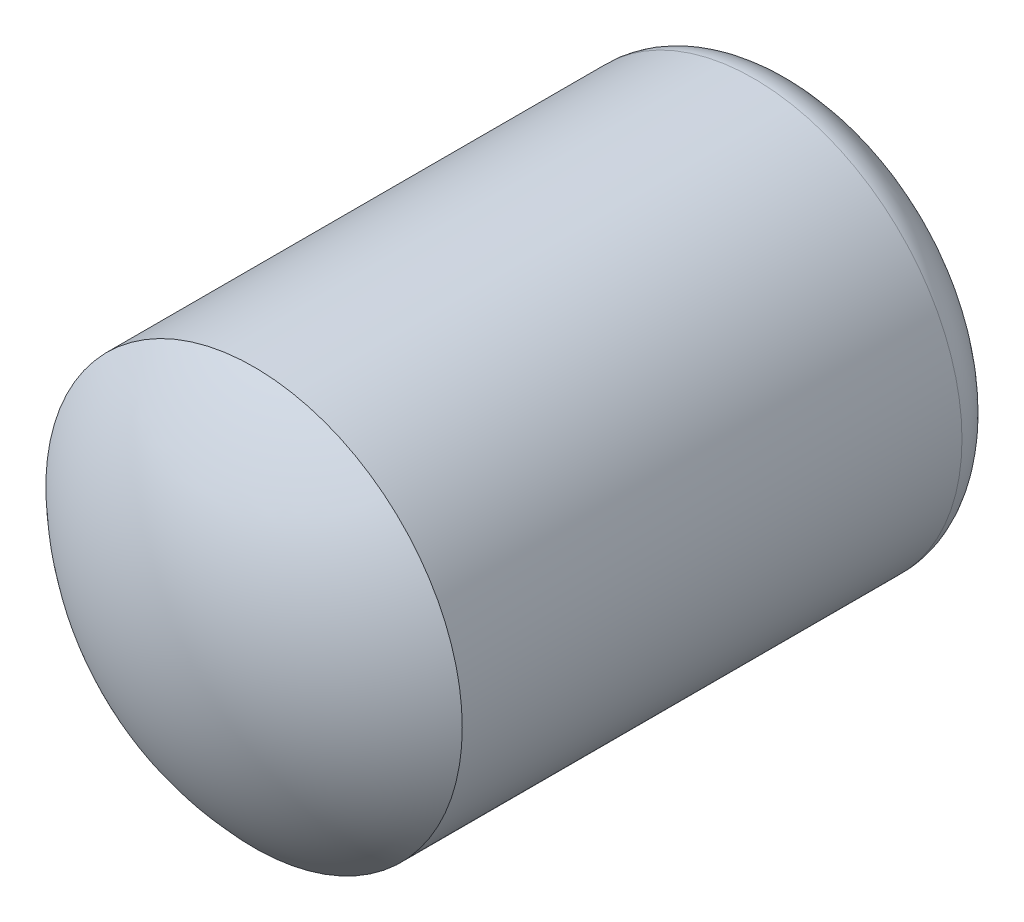
ISO-10303-21;
HEADER;
FILE_DESCRIPTION(('STEP AP214'),'2;1');
FILE_NAME('part.step','',(''),(''),'','','');
FILE_SCHEMA(('AUTOMOTIVE_DESIGN { 1 0 10303 214 1 1 1 1 }'));
ENDSEC;
DATA;
#1=APPLICATION_CONTEXT('core data for automotive mechanical design processes');
#2=APPLICATION_PROTOCOL_DEFINITION('international standard','automotive_design',2000,#1);
#3=PRODUCT_CONTEXT('',#1,'mechanical');
#4=PRODUCT('Part','Part','',(#3));
#5=PRODUCT_RELATED_PRODUCT_CATEGORY('part','',(#4));
#6=PRODUCT_DEFINITION_FORMATION('','',#4);
#7=PRODUCT_DEFINITION_CONTEXT('part definition',#1,'design');
#8=PRODUCT_DEFINITION('design','',#6,#7);
#9=PRODUCT_DEFINITION_SHAPE('','',#8);
#10=(LENGTH_UNIT() NAMED_UNIT(*) SI_UNIT(.MILLI.,.METRE.));
#11=(NAMED_UNIT(*) PLANE_ANGLE_UNIT() SI_UNIT($,.RADIAN.));
#12=(NAMED_UNIT(*) SI_UNIT($,.STERADIAN.) SOLID_ANGLE_UNIT());
#13=UNCERTAINTY_MEASURE_WITH_UNIT(LENGTH_MEASURE(1.E-05),#10,'distance_accuracy_value','');
#14=(GEOMETRIC_REPRESENTATION_CONTEXT(3) GLOBAL_UNCERTAINTY_ASSIGNED_CONTEXT((#13)) GLOBAL_UNIT_ASSIGNED_CONTEXT((#10,
#11,#12)) REPRESENTATION_CONTEXT('',''));
#15=CARTESIAN_POINT('',(0.,0.,0.));
#16=DIRECTION('',(0.,0.,1.));
#17=DIRECTION('',(1.,0.,0.));
#18=AXIS2_PLACEMENT_3D('',#15,#16,#17);
#19=CARTESIAN_POINT('',(114.423401370023,123.880750732838,2.54));
#20=DIRECTION('',(0.,0.,-1.));
#21=DIRECTION('',(-1.,0.,0.));
#22=AXIS2_PLACEMENT_3D('',#19,#20,#21);
#23=CYLINDRICAL_SURFACE('',#22,12.699999999999);
#24=CARTESIAN_POINT('',(114.423401370023,123.880750732838,2.54));
#25=DIRECTION('',(0.,0.,1.));
#26=DIRECTION('',(1.,0.,0.));
#27=AXIS2_PLACEMENT_3D('',#24,#25,#26);
#28=CIRCLE('',#27,12.699999999999);
#29=CARTESIAN_POINT('',(127.123401370022,123.880750732838,2.54));
#30=VERTEX_POINT('',#29);
#31=EDGE_CURVE('E11',#30,#30,#28,.T.);
#32=ORIENTED_EDGE('',*,*,#31,.F.);
#33=EDGE_LOOP('',(#32));
#34=FACE_BOUND('',#33,.T.);
#35=CARTESIAN_POINT('',(114.423401370023,123.880750732838,-27.94));
#36=DIRECTION('',(0.,0.,1.));
#37=DIRECTION('',(1.,0.,0.));
#38=AXIS2_PLACEMENT_3D('',#35,#36,#37);
#39=CIRCLE('',#38,12.699999999999);
#40=CARTESIAN_POINT('',(127.123401370022,123.880750732838,-27.94));
#41=VERTEX_POINT('',#40);
#42=EDGE_CURVE('E44',#41,#41,#39,.T.);
#43=ORIENTED_EDGE('',*,*,#42,.T.);
#44=EDGE_LOOP('',(#43));
#45=FACE_BOUND('',#44,.T.);
#46=ADVANCED_FACE('F37',(#34,#45),#23,.T.);
#47=CARTESIAN_POINT('',(114.423401370023,123.880750732838,-10.7949999999975));
#48=DIRECTION('',(0.,0.,1.));
#49=DIRECTION('',(1.,0.,0.));
#50=AXIS2_PLACEMENT_3D('',#47,#48,#49);
#51=SPHERICAL_SURFACE('',#50,18.4149999999975);
#52=ORIENTED_EDGE('',*,*,#31,.T.);
#53=EDGE_LOOP('',(#52));
#54=FACE_BOUND('',#53,.T.);
#55=ADVANCED_FACE('F39',(#54),#51,.T.);
#56=CARTESIAN_POINT('',(114.423401370023,123.880750732838,-27.94));
#57=DIRECTION('',(0.,-1.,0.));
#58=DIRECTION('',(1.,0.,0.));
#59=AXIS2_PLACEMENT_3D('',#56,#57,#58);
#60=ELLIPSE('',#59,12.699999999999,5.08);
#61=TRIMMED_CURVE('',#60,(PARAMETER_VALUE(4.71238898038469)),
(PARAMETER_VALUE(7.85398163397448)),.T.,.PARAMETER.);
#62=CARTESIAN_POINT('',(114.423401370023,123.880750732838,-22.86));
#63=DIRECTION('',(0.,0.,-1.));
#64=AXIS1_PLACEMENT('',#62,#63);
#65=SURFACE_OF_REVOLUTION('',#61,#64);
#66=CARTESIAN_POINT('',(114.423401370023,123.880750732838,-33.02));
#67=VERTEX_POINT('',#66);
#68=VERTEX_LOOP('',#67);
#69=FACE_BOUND('',#68,.T.);
#70=ORIENTED_EDGE('',*,*,#42,.F.);
#71=EDGE_LOOP('',(#70));
#72=FACE_BOUND('',#71,.T.);
#73=ADVANCED_FACE('F47',(#69,#72),#65,.F.);
#74=CLOSED_SHELL('',(#46,#55,#73));
#75=MANIFOLD_SOLID_BREP('B2',#74);
#76=ADVANCED_BREP_SHAPE_REPRESENTATION('',(#18,#75),#14);
#77=SHAPE_DEFINITION_REPRESENTATION(#9,#76);
ENDSEC;
END-ISO-10303-21;
